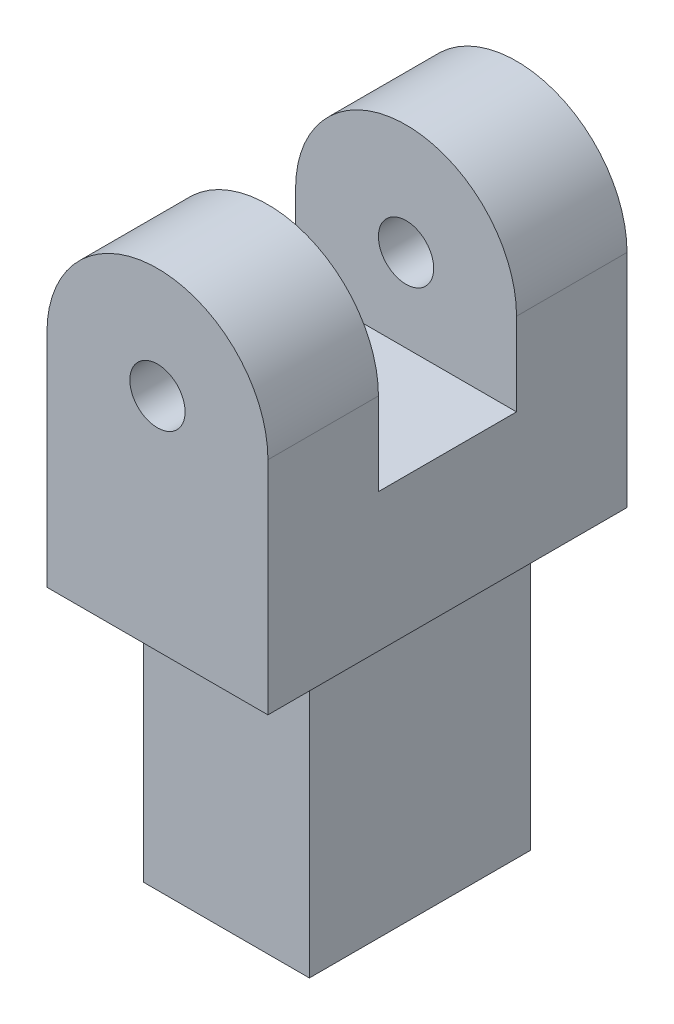
ISO-10303-21;
HEADER;
FILE_DESCRIPTION(('STEP AP214'),'2;1');
FILE_NAME('part.step','',(''),(''),'','','');
FILE_SCHEMA(('AUTOMOTIVE_DESIGN { 1 0 10303 214 1 1 1 1 }'));
ENDSEC;
DATA;
#1=APPLICATION_CONTEXT('core data for automotive mechanical design processes');
#2=APPLICATION_PROTOCOL_DEFINITION('international standard','automotive_design',2000,#1);
#3=PRODUCT_CONTEXT('',#1,'mechanical');
#4=PRODUCT('Part','Part','',(#3));
#5=PRODUCT_RELATED_PRODUCT_CATEGORY('part','',(#4));
#6=PRODUCT_DEFINITION_FORMATION('','',#4);
#7=PRODUCT_DEFINITION_CONTEXT('part definition',#1,'design');
#8=PRODUCT_DEFINITION('design','',#6,#7);
#9=PRODUCT_DEFINITION_SHAPE('','',#8);
#10=(LENGTH_UNIT() NAMED_UNIT(*) SI_UNIT(.MILLI.,.METRE.));
#11=(NAMED_UNIT(*) PLANE_ANGLE_UNIT() SI_UNIT($,.RADIAN.));
#12=(NAMED_UNIT(*) SI_UNIT($,.STERADIAN.) SOLID_ANGLE_UNIT());
#13=UNCERTAINTY_MEASURE_WITH_UNIT(LENGTH_MEASURE(1.E-05),#10,'distance_accuracy_value','');
#14=(GEOMETRIC_REPRESENTATION_CONTEXT(3) GLOBAL_UNCERTAINTY_ASSIGNED_CONTEXT((#13)) GLOBAL_UNIT_ASSIGNED_CONTEXT((#10,
#11,#12)) REPRESENTATION_CONTEXT('',''));
#15=CARTESIAN_POINT('',(0.,0.,0.));
#16=DIRECTION('',(0.,0.,1.));
#17=DIRECTION('',(1.,0.,0.));
#18=AXIS2_PLACEMENT_3D('',#15,#16,#17);
#19=CARTESIAN_POINT('',(-4.,12.,6.5));
#20=DIRECTION('',(0.,0.,-1.));
#21=DIRECTION('',(-1.,0.,0.));
#22=AXIS2_PLACEMENT_3D('',#19,#20,#21);
#23=PLANE('',#22);
#24=CARTESIAN_POINT('',(0.,8.,6.5));
#25=DIRECTION('',(0.,0.,-1.));
#26=DIRECTION('',(-1.,0.,0.));
#27=AXIS2_PLACEMENT_3D('',#24,#25,#26);
#28=CIRCLE('',#27,1.);
#29=CARTESIAN_POINT('',(-1.,8.,6.5));
#30=VERTEX_POINT('',#29);
#31=EDGE_CURVE('E164',#30,#30,#28,.T.);
#32=ORIENTED_EDGE('',*,*,#31,.T.);
#33=EDGE_LOOP('',(#32));
#34=FACE_BOUND('',#33,.T.);
#35=CARTESIAN_POINT('',(0.,8.,6.5));
#36=DIRECTION('',(0.,0.,1.));
#37=DIRECTION('',(1.,0.,0.));
#38=AXIS2_PLACEMENT_3D('',#35,#36,#37);
#39=CIRCLE('',#38,4.);
#40=CARTESIAN_POINT('',(-4.,8.,6.5));
#41=VERTEX_POINT('',#40);
#42=CARTESIAN_POINT('',(4.,8.,6.5));
#43=VERTEX_POINT('',#42);
#44=EDGE_CURVE('E152',#41,#43,#39,.F.);
#45=ORIENTED_EDGE('',*,*,#44,.F.);
#46=DIRECTION('',(0.,-1.,0.));
#47=VECTOR('',#46,1.);
#48=CARTESIAN_POINT('',(-4.,12.,6.5));
#49=LINE('',#48,#47);
#50=CARTESIAN_POINT('',(-4.,0.,6.5));
#51=VERTEX_POINT('',#50);
#52=EDGE_CURVE('E210',#41,#51,#49,.T.);
#53=ORIENTED_EDGE('',*,*,#52,.T.);
#54=DIRECTION('',(1.,0.,0.));
#55=VECTOR('',#54,1.);
#56=CARTESIAN_POINT('',(-4.,0.,6.5));
#57=LINE('',#56,#55);
#58=CARTESIAN_POINT('',(4.,0.,6.5));
#59=VERTEX_POINT('',#58);
#60=EDGE_CURVE('E195',#51,#59,#57,.T.);
#61=ORIENTED_EDGE('',*,*,#60,.T.);
#62=DIRECTION('',(0.,-1.,0.));
#63=VECTOR('',#62,1.);
#64=CARTESIAN_POINT('',(4.,12.,6.5));
#65=LINE('',#64,#63);
#66=EDGE_CURVE('E208',#43,#59,#65,.T.);
#67=ORIENTED_EDGE('',*,*,#66,.F.);
#68=EDGE_LOOP('',(#45,#53,#61,#67));
#69=FACE_BOUND('',#68,.T.);
#70=ADVANCED_FACE('F33',(#34,#69),#23,.F.);
#71=CARTESIAN_POINT('',(-4.,12.,-6.5));
#72=DIRECTION('',(0.,0.,1.));
#73=DIRECTION('',(1.,0.,0.));
#74=AXIS2_PLACEMENT_3D('',#71,#72,#73);
#75=PLANE('',#74);
#76=CARTESIAN_POINT('',(0.,8.,-6.5));
#77=DIRECTION('',(0.,0.,-1.));
#78=DIRECTION('',(-1.,0.,0.));
#79=AXIS2_PLACEMENT_3D('',#76,#77,#78);
#80=CIRCLE('',#79,1.);
#81=CARTESIAN_POINT('',(-1.,8.,-6.5));
#82=VERTEX_POINT('',#81);
#83=EDGE_CURVE('E163',#82,#82,#80,.T.);
#84=ORIENTED_EDGE('',*,*,#83,.F.);
#85=EDGE_LOOP('',(#84));
#86=FACE_BOUND('',#85,.T.);
#87=DIRECTION('',(0.,-1.,0.));
#88=VECTOR('',#87,1.);
#89=CARTESIAN_POINT('',(-4.,12.,-6.5));
#90=LINE('',#89,#88);
#91=CARTESIAN_POINT('',(-4.,8.,-6.5));
#92=VERTEX_POINT('',#91);
#93=CARTESIAN_POINT('',(-4.,0.,-6.5));
#94=VERTEX_POINT('',#93);
#95=EDGE_CURVE('E204',#92,#94,#90,.T.);
#96=ORIENTED_EDGE('',*,*,#95,.F.);
#97=CARTESIAN_POINT('',(0.,8.,-6.5));
#98=DIRECTION('',(0.,0.,1.));
#99=DIRECTION('',(1.,0.,0.));
#100=AXIS2_PLACEMENT_3D('',#97,#98,#99);
#101=CIRCLE('',#100,4.);
#102=CARTESIAN_POINT('',(4.,8.,-6.5));
#103=VERTEX_POINT('',#102);
#104=EDGE_CURVE('E151',#92,#103,#101,.F.);
#105=ORIENTED_EDGE('',*,*,#104,.T.);
#106=DIRECTION('',(0.,-1.,0.));
#107=VECTOR('',#106,1.);
#108=CARTESIAN_POINT('',(4.,12.,-6.5));
#109=LINE('',#108,#107);
#110=CARTESIAN_POINT('',(4.,0.,-6.5));
#111=VERTEX_POINT('',#110);
#112=EDGE_CURVE('E206',#103,#111,#109,.T.);
#113=ORIENTED_EDGE('',*,*,#112,.T.);
#114=DIRECTION('',(-1.,0.,0.));
#115=VECTOR('',#114,1.);
#116=CARTESIAN_POINT('',(-4.,0.,-6.5));
#117=LINE('',#116,#115);
#118=EDGE_CURVE('E201',#111,#94,#117,.T.);
#119=ORIENTED_EDGE('',*,*,#118,.T.);
#120=EDGE_LOOP('',(#96,#105,#113,#119));
#121=FACE_BOUND('',#120,.T.);
#122=ADVANCED_FACE('F237',(#86,#121),#75,.F.);
#123=CARTESIAN_POINT('',(-6.5,5.,-2.5));
#124=DIRECTION('',(0.,0.,-1.));
#125=DIRECTION('',(-1.,0.,0.));
#126=AXIS2_PLACEMENT_3D('',#123,#124,#125);
#127=PLANE('',#126);
#128=CARTESIAN_POINT('',(0.,8.,-2.5));
#129=DIRECTION('',(0.,0.,-1.));
#130=DIRECTION('',(-1.,0.,0.));
#131=AXIS2_PLACEMENT_3D('',#128,#129,#130);
#132=CIRCLE('',#131,1.);
#133=CARTESIAN_POINT('',(-1.,8.,-2.5));
#134=VERTEX_POINT('',#133);
#135=EDGE_CURVE('E170',#134,#134,#132,.T.);
#136=ORIENTED_EDGE('',*,*,#135,.T.);
#137=EDGE_LOOP('',(#136));
#138=FACE_BOUND('',#137,.T.);
#139=CARTESIAN_POINT('',(0.,8.,-2.5));
#140=DIRECTION('',(0.,0.,-1.));
#141=DIRECTION('',(-1.,0.,0.));
#142=AXIS2_PLACEMENT_3D('',#139,#140,#141);
#143=CIRCLE('',#142,4.);
#144=CARTESIAN_POINT('',(-4.,8.,-2.5));
#145=VERTEX_POINT('',#144);
#146=CARTESIAN_POINT('',(4.,8.,-2.50000000000002));
#147=VERTEX_POINT('',#146);
#148=EDGE_CURVE('E160',#145,#147,#143,.T.);
#149=ORIENTED_EDGE('',*,*,#148,.F.);
#150=DIRECTION('',(0.,1.,0.));
#151=VECTOR('',#150,1.);
#152=CARTESIAN_POINT('',(-4.,12.,-2.5));
#153=LINE('',#152,#151);
#154=CARTESIAN_POINT('',(-4.,5.,-2.5));
#155=VERTEX_POINT('',#154);
#156=EDGE_CURVE('E186',#155,#145,#153,.T.);
#157=ORIENTED_EDGE('',*,*,#156,.F.);
#158=DIRECTION('',(-1.,0.,0.));
#159=VECTOR('',#158,1.);
#160=CARTESIAN_POINT('',(-6.5,5.,-2.5));
#161=LINE('',#160,#159);
#162=CARTESIAN_POINT('',(4.,5.,-2.5));
#163=VERTEX_POINT('',#162);
#164=EDGE_CURVE('E176',#163,#155,#161,.T.);
#165=ORIENTED_EDGE('',*,*,#164,.F.);
#166=DIRECTION('',(0.,-1.,0.));
#167=VECTOR('',#166,1.);
#168=CARTESIAN_POINT('',(4.,12.,-2.5));
#169=LINE('',#168,#167);
#170=EDGE_CURVE('E184',#147,#163,#169,.T.);
#171=ORIENTED_EDGE('',*,*,#170,.F.);
#172=EDGE_LOOP('',(#149,#157,#165,#171));
#173=FACE_BOUND('',#172,.T.);
#174=ADVANCED_FACE('F242',(#138,#173),#127,.F.);
#175=CARTESIAN_POINT('',(-6.5,5.,2.5));
#176=DIRECTION('',(0.,0.,1.));
#177=DIRECTION('',(1.,0.,0.));
#178=AXIS2_PLACEMENT_3D('',#175,#176,#177);
#179=PLANE('',#178);
#180=CARTESIAN_POINT('',(0.,8.,2.5));
#181=DIRECTION('',(0.,0.,1.));
#182=DIRECTION('',(1.,0.,0.));
#183=AXIS2_PLACEMENT_3D('',#180,#181,#182);
#184=CIRCLE('',#183,1.);
#185=CARTESIAN_POINT('',(-1.,8.,2.5));
#186=VERTEX_POINT('',#185);
#187=EDGE_CURVE('E167',#186,#186,#184,.T.);
#188=ORIENTED_EDGE('',*,*,#187,.T.);
#189=EDGE_LOOP('',(#188));
#190=FACE_BOUND('',#189,.T.);
#191=DIRECTION('',(0.,-1.,0.));
#192=VECTOR('',#191,1.);
#193=CARTESIAN_POINT('',(-4.,12.,2.5));
#194=LINE('',#193,#192);
#195=CARTESIAN_POINT('',(-4.,8.,2.5));
#196=VERTEX_POINT('',#195);
#197=CARTESIAN_POINT('',(-4.,5.,2.5));
#198=VERTEX_POINT('',#197);
#199=EDGE_CURVE('E182',#196,#198,#194,.T.);
#200=ORIENTED_EDGE('',*,*,#199,.F.);
#201=CARTESIAN_POINT('',(0.,8.,2.5));
#202=DIRECTION('',(0.,0.,1.));
#203=DIRECTION('',(1.,0.,0.));
#204=AXIS2_PLACEMENT_3D('',#201,#202,#203);
#205=CIRCLE('',#204,4.);
#206=CARTESIAN_POINT('',(4.,8.,2.5));
#207=VERTEX_POINT('',#206);
#208=EDGE_CURVE('E11',#207,#196,#205,.T.);
#209=ORIENTED_EDGE('',*,*,#208,.F.);
#210=DIRECTION('',(0.,1.,0.));
#211=VECTOR('',#210,1.);
#212=CARTESIAN_POINT('',(4.,12.,2.5));
#213=LINE('',#212,#211);
#214=CARTESIAN_POINT('',(4.,5.,2.5));
#215=VERTEX_POINT('',#214);
#216=EDGE_CURVE('E179',#215,#207,#213,.T.);
#217=ORIENTED_EDGE('',*,*,#216,.F.);
#218=DIRECTION('',(1.,0.,0.));
#219=VECTOR('',#218,1.);
#220=CARTESIAN_POINT('',(-6.5,5.,2.5));
#221=LINE('',#220,#219);
#222=EDGE_CURVE('E173',#198,#215,#221,.T.);
#223=ORIENTED_EDGE('',*,*,#222,.F.);
#224=EDGE_LOOP('',(#200,#209,#217,#223));
#225=FACE_BOUND('',#224,.T.);
#226=ADVANCED_FACE('F216',(#190,#225),#179,.F.);
#227=CARTESIAN_POINT('',(-4.,12.,6.5));
#228=DIRECTION('',(1.,0.,0.));
#229=DIRECTION('',(0.,0.,-1.));
#230=AXIS2_PLACEMENT_3D('',#227,#228,#229);
#231=PLANE('',#230);
#232=ORIENTED_EDGE('',*,*,#52,.F.);
#233=DIRECTION('',(0.,0.,1.));
#234=VECTOR('',#233,1.);
#235=CARTESIAN_POINT('',(-4.,8.,-30.7706097986845));
#236=LINE('',#235,#234);
#237=EDGE_CURVE('E141',#196,#41,#236,.T.);
#238=ORIENTED_EDGE('',*,*,#237,.F.);
#239=ORIENTED_EDGE('',*,*,#199,.T.);
#240=DIRECTION('',(0.,0.,-1.));
#241=VECTOR('',#240,1.);
#242=CARTESIAN_POINT('',(-4.,5.,6.5));
#243=LINE('',#242,#241);
#244=EDGE_CURVE('E189',#198,#155,#243,.T.);
#245=ORIENTED_EDGE('',*,*,#244,.T.);
#246=ORIENTED_EDGE('',*,*,#156,.T.);
#247=EDGE_CURVE('E144',#92,#145,#236,.T.);
#248=ORIENTED_EDGE('',*,*,#247,.F.);
#249=ORIENTED_EDGE('',*,*,#95,.T.);
#250=DIRECTION('',(0.,0.,1.));
#251=VECTOR('',#250,1.);
#252=CARTESIAN_POINT('',(-4.,0.,6.5));
#253=LINE('',#252,#251);
#254=EDGE_CURVE('E192',#94,#51,#253,.T.);
#255=ORIENTED_EDGE('',*,*,#254,.T.);
#256=EDGE_LOOP('',(#232,#238,#239,#245,#246,#248,#249,#255));
#257=FACE_BOUND('',#256,.T.);
#258=ADVANCED_FACE('F35',(#257),#231,.F.);
#259=CARTESIAN_POINT('',(4.,12.,6.5));
#260=DIRECTION('',(-1.,0.,0.));
#261=DIRECTION('',(0.,0.,1.));
#262=AXIS2_PLACEMENT_3D('',#259,#260,#261);
#263=PLANE('',#262);
#264=ORIENTED_EDGE('',*,*,#112,.F.);
#265=DIRECTION('',(0.,0.,1.));
#266=VECTOR('',#265,1.);
#267=CARTESIAN_POINT('',(4.,8.,-35.7706097986845));
#268=LINE('',#267,#266);
#269=EDGE_CURVE('E157',#103,#147,#268,.T.);
#270=ORIENTED_EDGE('',*,*,#269,.T.);
#271=ORIENTED_EDGE('',*,*,#170,.T.);
#272=DIRECTION('',(0.,0.,1.));
#273=VECTOR('',#272,1.);
#274=CARTESIAN_POINT('',(4.,5.,6.5));
#275=LINE('',#274,#273);
#276=EDGE_CURVE('E41',#163,#215,#275,.T.);
#277=ORIENTED_EDGE('',*,*,#276,.T.);
#278=ORIENTED_EDGE('',*,*,#216,.T.);
#279=EDGE_CURVE('E155',#207,#43,#268,.T.);
#280=ORIENTED_EDGE('',*,*,#279,.T.);
#281=ORIENTED_EDGE('',*,*,#66,.T.);
#282=DIRECTION('',(0.,0.,-1.));
#283=VECTOR('',#282,1.);
#284=CARTESIAN_POINT('',(4.,0.,6.5));
#285=LINE('',#284,#283);
#286=EDGE_CURVE('E198',#59,#111,#285,.T.);
#287=ORIENTED_EDGE('',*,*,#286,.T.);
#288=EDGE_LOOP('',(#264,#270,#271,#277,#278,#280,#281,#287));
#289=FACE_BOUND('',#288,.T.);
#290=ADVANCED_FACE('F247',(#289),#263,.F.);
#291=CARTESIAN_POINT('',(0.,0.,0.));
#292=DIRECTION('',(0.,-1.,0.));
#293=DIRECTION('',(0.,0.,-1.));
#294=AXIS2_PLACEMENT_3D('',#291,#292,#293);
#295=PLANE('',#294);
#296=DIRECTION('',(0.,0.,-1.));
#297=VECTOR('',#296,1.);
#298=CARTESIAN_POINT('',(-3.,0.,-4.));
#299=LINE('',#298,#297);
#300=CARTESIAN_POINT('',(-3.,0.,4.));
#301=VERTEX_POINT('',#300);
#302=CARTESIAN_POINT('',(-3.,0.,-4.));
#303=VERTEX_POINT('',#302);
#304=EDGE_CURVE('E48',#301,#303,#299,.T.);
#305=ORIENTED_EDGE('',*,*,#304,.F.);
#306=DIRECTION('',(-1.,0.,0.));
#307=VECTOR('',#306,1.);
#308=CARTESIAN_POINT('',(-3.,0.,4.));
#309=LINE('',#308,#307);
#310=CARTESIAN_POINT('',(3.,0.,4.));
#311=VERTEX_POINT('',#310);
#312=EDGE_CURVE('E52',#311,#301,#309,.T.);
#313=ORIENTED_EDGE('',*,*,#312,.F.);
#314=DIRECTION('',(0.,0.,1.));
#315=VECTOR('',#314,1.);
#316=CARTESIAN_POINT('',(3.,0.,-4.));
#317=LINE('',#316,#315);
#318=CARTESIAN_POINT('',(3.,0.,-4.));
#319=VERTEX_POINT('',#318);
#320=EDGE_CURVE('E406',#319,#311,#317,.T.);
#321=ORIENTED_EDGE('',*,*,#320,.F.);
#322=DIRECTION('',(1.,0.,0.));
#323=VECTOR('',#322,1.);
#324=CARTESIAN_POINT('',(-3.,0.,-4.));
#325=LINE('',#324,#323);
#326=EDGE_CURVE('E412',#303,#319,#325,.T.);
#327=ORIENTED_EDGE('',*,*,#326,.F.);
#328=EDGE_LOOP('',(#305,#313,#321,#327));
#329=FACE_BOUND('',#328,.T.);
#330=ORIENTED_EDGE('',*,*,#254,.F.);
#331=ORIENTED_EDGE('',*,*,#118,.F.);
#332=ORIENTED_EDGE('',*,*,#286,.F.);
#333=ORIENTED_EDGE('',*,*,#60,.F.);
#334=EDGE_LOOP('',(#330,#331,#332,#333));
#335=FACE_BOUND('',#334,.T.);
#336=ADVANCED_FACE('F231',(#329,#335),#295,.T.);
#337=CARTESIAN_POINT('',(0.,5.,0.));
#338=DIRECTION('',(0.,-1.,0.));
#339=DIRECTION('',(0.,0.,-1.));
#340=AXIS2_PLACEMENT_3D('',#337,#338,#339);
#341=PLANE('',#340);
#342=ORIENTED_EDGE('',*,*,#222,.T.);
#343=ORIENTED_EDGE('',*,*,#276,.F.);
#344=ORIENTED_EDGE('',*,*,#164,.T.);
#345=ORIENTED_EDGE('',*,*,#244,.F.);
#346=EDGE_LOOP('',(#342,#343,#344,#345));
#347=FACE_BOUND('',#346,.T.);
#348=ADVANCED_FACE('F222',(#347),#341,.F.);
#349=CARTESIAN_POINT('',(0.,8.,6.5));
#350=DIRECTION('',(0.,0.,-1.));
#351=DIRECTION('',(-1.,0.,0.));
#352=AXIS2_PLACEMENT_3D('',#349,#350,#351);
#353=CYLINDRICAL_SURFACE('',#352,1.);
#354=CARTESIAN_POINT('',(-1.,8.,6.5));
#355=CARTESIAN_POINT('',(-1.,8.,6.45833333333333));
#356=CARTESIAN_POINT('',(-1.,8.,6.41666666666667));
#357=CARTESIAN_POINT('',(-1.,8.,6.33333333333333));
#358=CARTESIAN_POINT('',(-1.,8.,6.29166666666667));
#359=CARTESIAN_POINT('',(-1.,8.,6.20833333333333));
#360=CARTESIAN_POINT('',(-1.,8.,6.16666666666667));
#361=CARTESIAN_POINT('',(-1.,8.,6.08333333333333));
#362=CARTESIAN_POINT('',(-1.,8.,6.04166666666667));
#363=CARTESIAN_POINT('',(-1.,8.,5.95833333333333));
#364=CARTESIAN_POINT('',(-1.,8.,5.91666666666667));
#365=CARTESIAN_POINT('',(-1.,8.,5.83333333333333));
#366=CARTESIAN_POINT('',(-1.,8.,5.79166666666667));
#367=CARTESIAN_POINT('',(-1.,8.,5.70833333333333));
#368=CARTESIAN_POINT('',(-1.,8.,5.66666666666667));
#369=CARTESIAN_POINT('',(-1.,8.,5.58333333333333));
#370=CARTESIAN_POINT('',(-1.,8.,5.54166666666667));
#371=CARTESIAN_POINT('',(-1.,8.,5.45833333333333));
#372=CARTESIAN_POINT('',(-1.,8.,5.41666666666667));
#373=CARTESIAN_POINT('',(-1.,8.,5.33333333333333));
#374=CARTESIAN_POINT('',(-1.,8.,5.29166666666667));
#375=CARTESIAN_POINT('',(-1.,8.,5.20833333333333));
#376=CARTESIAN_POINT('',(-1.,8.,5.16666666666667));
#377=CARTESIAN_POINT('',(-1.,8.,5.08333333333333));
#378=CARTESIAN_POINT('',(-1.,8.,5.04166666666667));
#379=CARTESIAN_POINT('',(-1.,8.,4.95833333333333));
#380=CARTESIAN_POINT('',(-1.,8.,4.91666666666667));
#381=CARTESIAN_POINT('',(-1.,8.,4.83333333333333));
#382=CARTESIAN_POINT('',(-1.,8.,4.79166666666667));
#383=CARTESIAN_POINT('',(-1.,8.,4.70833333333333));
#384=CARTESIAN_POINT('',(-1.,8.,4.66666666666667));
#385=CARTESIAN_POINT('',(-1.,8.,4.58333333333333));
#386=CARTESIAN_POINT('',(-1.,8.,4.54166666666667));
#387=CARTESIAN_POINT('',(-1.,8.,4.45833333333333));
#388=CARTESIAN_POINT('',(-1.,8.,4.41666666666667));
#389=CARTESIAN_POINT('',(-1.,8.,4.33333333333333));
#390=CARTESIAN_POINT('',(-1.,8.,4.29166666666667));
#391=CARTESIAN_POINT('',(-1.,8.,4.20833333333333));
#392=CARTESIAN_POINT('',(-1.,8.,4.16666666666667));
#393=CARTESIAN_POINT('',(-1.,8.,4.08333333333333));
#394=CARTESIAN_POINT('',(-1.,8.,4.04166666666667));
#395=CARTESIAN_POINT('',(-1.,8.,3.95833333333333));
#396=CARTESIAN_POINT('',(-1.,8.,3.91666666666667));
#397=CARTESIAN_POINT('',(-1.,8.,3.83333333333333));
#398=CARTESIAN_POINT('',(-1.,8.,3.79166666666667));
#399=CARTESIAN_POINT('',(-1.,8.,3.70833333333333));
#400=CARTESIAN_POINT('',(-1.,8.,3.66666666666667));
#401=CARTESIAN_POINT('',(-1.,8.,3.58333333333333));
#402=CARTESIAN_POINT('',(-1.,8.,3.54166666666667));
#403=CARTESIAN_POINT('',(-1.,8.,3.45833333333333));
#404=CARTESIAN_POINT('',(-1.,8.,3.41666666666667));
#405=CARTESIAN_POINT('',(-1.,8.,3.33333333333333));
#406=CARTESIAN_POINT('',(-1.,8.,3.29166666666667));
#407=CARTESIAN_POINT('',(-1.,8.,3.20833333333333));
#408=CARTESIAN_POINT('',(-1.,8.,3.16666666666667));
#409=CARTESIAN_POINT('',(-1.,8.,3.08333333333333));
#410=CARTESIAN_POINT('',(-1.,8.,3.04166666666667));
#411=CARTESIAN_POINT('',(-1.,8.,2.95833333333333));
#412=CARTESIAN_POINT('',(-1.,8.,2.91666666666667));
#413=CARTESIAN_POINT('',(-1.,8.,2.83333333333333));
#414=CARTESIAN_POINT('',(-1.,8.,2.79166666666667));
#415=CARTESIAN_POINT('',(-1.,8.,2.70833333333333));
#416=CARTESIAN_POINT('',(-1.,8.,2.66666666666667));
#417=CARTESIAN_POINT('',(-1.,8.,2.58333333333333));
#418=CARTESIAN_POINT('',(-1.,8.,2.54166666666667));
#419=CARTESIAN_POINT('',(-1.,8.,2.5));
#420=B_SPLINE_CURVE_WITH_KNOTS('',3,(#354,#355,#356,#357,#358,#359,#360,#361,#362,#363,#364,
#365,#366,#367,#368,#369,#370,#371,#372,#373,#374,#375,#376,#377,#378,#379,#380,#381,#382,#383,
#384,#385,#386,#387,#388,#389,#390,#391,#392,#393,#394,#395,#396,#397,#398,#399,#400,#401,#402,
#403,#404,#405,#406,#407,#408,#409,#410,#411,#412,#413,#414,#415,#416,#417,#418,#419),
.UNSPECIFIED.,.F.,.F.,(4,2,2,2,2,2,2,2,2,2,2,2,2,2,2,2,2,2,2,2,2,2,2,2,2,2,2,2,2,2,2,2,4),(0.,
0.125,0.25,0.375,0.5,0.625000000000001,0.75,0.875,1.,1.125,1.25,1.375,1.5,1.625,1.75,1.875,2.,
2.125,2.25,2.375,2.5,2.625,2.75,2.875,3.,3.125,3.25,3.375,3.5,3.625,3.75,3.875,4.),.UNSPECIFIED.);
#421=EDGE_CURVE('BSEAM219',#30,#186,#420,.T.);
#422=ORIENTED_EDGE('',*,*,#31,.F.);
#423=ORIENTED_EDGE('',*,*,#187,.F.);
#424=ORIENTED_EDGE('',*,*,#421,.T.);
#425=ORIENTED_EDGE('',*,*,#421,.F.);
#426=EDGE_LOOP('',(#422,#424,#423,#425));
#427=FACE_BOUND('',#426,.T.);
#428=ADVANCED_FACE('F219',(#427),#353,.F.);
#429=CARTESIAN_POINT('',(-1.,8.,-6.5));
#430=CARTESIAN_POINT('',(-1.,8.,-6.45833333333333));
#431=CARTESIAN_POINT('',(-1.,8.,-6.41666666666667));
#432=CARTESIAN_POINT('',(-1.,8.,-6.33333333333333));
#433=CARTESIAN_POINT('',(-1.,8.,-6.29166666666667));
#434=CARTESIAN_POINT('',(-1.,8.,-6.20833333333333));
#435=CARTESIAN_POINT('',(-1.,8.,-6.16666666666667));
#436=CARTESIAN_POINT('',(-1.,8.,-6.08333333333333));
#437=CARTESIAN_POINT('',(-1.,8.,-6.04166666666667));
#438=CARTESIAN_POINT('',(-1.,8.,-5.95833333333333));
#439=CARTESIAN_POINT('',(-1.,8.,-5.91666666666667));
#440=CARTESIAN_POINT('',(-1.,8.,-5.83333333333333));
#441=CARTESIAN_POINT('',(-1.,8.,-5.79166666666667));
#442=CARTESIAN_POINT('',(-1.,8.,-5.70833333333333));
#443=CARTESIAN_POINT('',(-1.,8.,-5.66666666666667));
#444=CARTESIAN_POINT('',(-1.,8.,-5.58333333333333));
#445=CARTESIAN_POINT('',(-1.,8.,-5.54166666666667));
#446=CARTESIAN_POINT('',(-1.,8.,-5.45833333333333));
#447=CARTESIAN_POINT('',(-1.,8.,-5.41666666666667));
#448=CARTESIAN_POINT('',(-1.,8.,-5.33333333333333));
#449=CARTESIAN_POINT('',(-1.,8.,-5.29166666666667));
#450=CARTESIAN_POINT('',(-1.,8.,-5.20833333333333));
#451=CARTESIAN_POINT('',(-1.,8.,-5.16666666666667));
#452=CARTESIAN_POINT('',(-1.,8.,-5.08333333333333));
#453=CARTESIAN_POINT('',(-1.,8.,-5.04166666666667));
#454=CARTESIAN_POINT('',(-1.,8.,-4.95833333333333));
#455=CARTESIAN_POINT('',(-1.,8.,-4.91666666666667));
#456=CARTESIAN_POINT('',(-1.,8.,-4.83333333333333));
#457=CARTESIAN_POINT('',(-1.,8.,-4.79166666666667));
#458=CARTESIAN_POINT('',(-1.,8.,-4.70833333333333));
#459=CARTESIAN_POINT('',(-1.,8.,-4.66666666666667));
#460=CARTESIAN_POINT('',(-1.,8.,-4.58333333333333));
#461=CARTESIAN_POINT('',(-1.,8.,-4.54166666666667));
#462=CARTESIAN_POINT('',(-1.,8.,-4.45833333333333));
#463=CARTESIAN_POINT('',(-1.,8.,-4.41666666666667));
#464=CARTESIAN_POINT('',(-1.,8.,-4.33333333333333));
#465=CARTESIAN_POINT('',(-1.,8.,-4.29166666666667));
#466=CARTESIAN_POINT('',(-1.,8.,-4.20833333333333));
#467=CARTESIAN_POINT('',(-1.,8.,-4.16666666666667));
#468=CARTESIAN_POINT('',(-1.,8.,-4.08333333333333));
#469=CARTESIAN_POINT('',(-1.,8.,-4.04166666666667));
#470=CARTESIAN_POINT('',(-1.,8.,-3.95833333333333));
#471=CARTESIAN_POINT('',(-1.,8.,-3.91666666666667));
#472=CARTESIAN_POINT('',(-1.,8.,-3.83333333333333));
#473=CARTESIAN_POINT('',(-1.,8.,-3.79166666666667));
#474=CARTESIAN_POINT('',(-1.,8.,-3.70833333333333));
#475=CARTESIAN_POINT('',(-1.,8.,-3.66666666666667));
#476=CARTESIAN_POINT('',(-1.,8.,-3.58333333333333));
#477=CARTESIAN_POINT('',(-1.,8.,-3.54166666666667));
#478=CARTESIAN_POINT('',(-1.,8.,-3.45833333333333));
#479=CARTESIAN_POINT('',(-1.,8.,-3.41666666666667));
#480=CARTESIAN_POINT('',(-1.,8.,-3.33333333333333));
#481=CARTESIAN_POINT('',(-1.,8.,-3.29166666666667));
#482=CARTESIAN_POINT('',(-1.,8.,-3.20833333333333));
#483=CARTESIAN_POINT('',(-1.,8.,-3.16666666666667));
#484=CARTESIAN_POINT('',(-1.,8.,-3.08333333333333));
#485=CARTESIAN_POINT('',(-1.,8.,-3.04166666666667));
#486=CARTESIAN_POINT('',(-1.,8.,-2.95833333333333));
#487=CARTESIAN_POINT('',(-1.,8.,-2.91666666666667));
#488=CARTESIAN_POINT('',(-1.,8.,-2.83333333333333));
#489=CARTESIAN_POINT('',(-1.,8.,-2.79166666666667));
#490=CARTESIAN_POINT('',(-1.,8.,-2.70833333333333));
#491=CARTESIAN_POINT('',(-1.,8.,-2.66666666666667));
#492=CARTESIAN_POINT('',(-1.,8.,-2.58333333333333));
#493=CARTESIAN_POINT('',(-1.,8.,-2.54166666666667));
#494=CARTESIAN_POINT('',(-1.,8.,-2.5));
#495=B_SPLINE_CURVE_WITH_KNOTS('',3,(#429,#430,#431,#432,#433,#434,#435,#436,#437,#438,#439,
#440,#441,#442,#443,#444,#445,#446,#447,#448,#449,#450,#451,#452,#453,#454,#455,#456,#457,#458,
#459,#460,#461,#462,#463,#464,#465,#466,#467,#468,#469,#470,#471,#472,#473,#474,#475,#476,#477,
#478,#479,#480,#481,#482,#483,#484,#485,#486,#487,#488,#489,#490,#491,#492,#493,#494),
.UNSPECIFIED.,.F.,.F.,(4,2,2,2,2,2,2,2,2,2,2,2,2,2,2,2,2,2,2,2,2,2,2,2,2,2,2,2,2,2,2,2,4),(0.,
0.125,0.25,0.375,0.5,0.625000000000001,0.750000000000001,0.875000000000001,1.,1.125,1.25,1.375,
1.5,1.625,1.75,1.875,2.,2.125,2.25,2.375,2.5,2.625,2.75,2.875,3.,3.125,3.25,3.375,3.5,3.625,
3.75,3.875,4.),.UNSPECIFIED.);
#496=EDGE_CURVE('BSEAM221',#82,#134,#495,.T.);
#497=ORIENTED_EDGE('',*,*,#83,.T.);
#498=ORIENTED_EDGE('',*,*,#135,.F.);
#499=ORIENTED_EDGE('',*,*,#496,.T.);
#500=ORIENTED_EDGE('',*,*,#496,.F.);
#501=EDGE_LOOP('',(#497,#499,#498,#500));
#502=FACE_BOUND('',#501,.T.);
#503=ADVANCED_FACE('F221',(#502),#353,.F.);
#504=CARTESIAN_POINT('',(0.,8.,-35.7706097986845));
#505=DIRECTION('',(0.,0.,1.));
#506=DIRECTION('',(1.,0.,0.));
#507=AXIS2_PLACEMENT_3D('',#504,#505,#506);
#508=CYLINDRICAL_SURFACE('',#507,4.);
#509=ORIENTED_EDGE('',*,*,#279,.F.);
#510=ORIENTED_EDGE('',*,*,#208,.T.);
#511=ORIENTED_EDGE('',*,*,#237,.T.);
#512=ORIENTED_EDGE('',*,*,#44,.T.);
#513=EDGE_LOOP('',(#509,#510,#511,#512));
#514=FACE_BOUND('',#513,.T.);
#515=ADVANCED_FACE('F229',(#514),#508,.T.);
#516=ORIENTED_EDGE('',*,*,#104,.F.);
#517=ORIENTED_EDGE('',*,*,#247,.T.);
#518=ORIENTED_EDGE('',*,*,#148,.T.);
#519=ORIENTED_EDGE('',*,*,#269,.F.);
#520=EDGE_LOOP('',(#516,#517,#518,#519));
#521=FACE_BOUND('',#520,.T.);
#522=ADVANCED_FACE('F265',(#521),#508,.T.);
#523=CARTESIAN_POINT('',(-3.,-10.,-4.));
#524=DIRECTION('',(1.,0.,0.));
#525=DIRECTION('',(0.,0.,-1.));
#526=AXIS2_PLACEMENT_3D('',#523,#524,#525);
#527=PLANE('',#526);
#528=ORIENTED_EDGE('',*,*,#304,.T.);
#529=DIRECTION('',(0.,1.,0.));
#530=VECTOR('',#529,1.);
#531=CARTESIAN_POINT('',(-3.,-10.,-4.));
#532=LINE('',#531,#530);
#533=CARTESIAN_POINT('',(-3.,-10.,-4.));
#534=VERTEX_POINT('',#533);
#535=EDGE_CURVE('E124',#534,#303,#532,.T.);
#536=ORIENTED_EDGE('',*,*,#535,.F.);
#537=DIRECTION('',(0.,0.,-1.));
#538=VECTOR('',#537,1.);
#539=CARTESIAN_POINT('',(-3.,-10.,-4.));
#540=LINE('',#539,#538);
#541=CARTESIAN_POINT('',(-3.,-10.,4.));
#542=VERTEX_POINT('',#541);
#543=EDGE_CURVE('E130',#542,#534,#540,.T.);
#544=ORIENTED_EDGE('',*,*,#543,.F.);
#545=DIRECTION('',(0.,1.,0.));
#546=VECTOR('',#545,1.);
#547=CARTESIAN_POINT('',(-3.,-10.,4.));
#548=LINE('',#547,#546);
#549=EDGE_CURVE('E404',#542,#301,#548,.T.);
#550=ORIENTED_EDGE('',*,*,#549,.T.);
#551=EDGE_LOOP('',(#528,#536,#544,#550));
#552=FACE_BOUND('',#551,.T.);
#553=ADVANCED_FACE('F140',(#552),#527,.F.);
#554=CARTESIAN_POINT('',(-3.,-10.,-4.));
#555=DIRECTION('',(0.,0.,1.));
#556=DIRECTION('',(1.,0.,0.));
#557=AXIS2_PLACEMENT_3D('',#554,#555,#556);
#558=PLANE('',#557);
#559=ORIENTED_EDGE('',*,*,#326,.T.);
#560=DIRECTION('',(0.,1.,0.));
#561=VECTOR('',#560,1.);
#562=CARTESIAN_POINT('',(3.,-10.,-4.));
#563=LINE('',#562,#561);
#564=CARTESIAN_POINT('',(3.,-10.,-4.));
#565=VERTEX_POINT('',#564);
#566=EDGE_CURVE('E126',#565,#319,#563,.T.);
#567=ORIENTED_EDGE('',*,*,#566,.F.);
#568=DIRECTION('',(1.,0.,0.));
#569=VECTOR('',#568,1.);
#570=CARTESIAN_POINT('',(-3.,-10.,-4.));
#571=LINE('',#570,#569);
#572=EDGE_CURVE('E119',#534,#565,#571,.T.);
#573=ORIENTED_EDGE('',*,*,#572,.F.);
#574=ORIENTED_EDGE('',*,*,#535,.T.);
#575=EDGE_LOOP('',(#559,#567,#573,#574));
#576=FACE_BOUND('',#575,.T.);
#577=ADVANCED_FACE('F122',(#576),#558,.F.);
#578=CARTESIAN_POINT('',(3.,-10.,-4.));
#579=DIRECTION('',(-1.,0.,0.));
#580=DIRECTION('',(0.,0.,1.));
#581=AXIS2_PLACEMENT_3D('',#578,#579,#580);
#582=PLANE('',#581);
#583=ORIENTED_EDGE('',*,*,#320,.T.);
#584=DIRECTION('',(0.,1.,0.));
#585=VECTOR('',#584,1.);
#586=CARTESIAN_POINT('',(3.,-10.,4.));
#587=LINE('',#586,#585);
#588=CARTESIAN_POINT('',(3.,-10.,4.));
#589=VERTEX_POINT('',#588);
#590=EDGE_CURVE('E146',#589,#311,#587,.T.);
#591=ORIENTED_EDGE('',*,*,#590,.F.);
#592=DIRECTION('',(0.,0.,1.));
#593=VECTOR('',#592,1.);
#594=CARTESIAN_POINT('',(3.,-10.,-4.));
#595=LINE('',#594,#593);
#596=EDGE_CURVE('E129',#565,#589,#595,.T.);
#597=ORIENTED_EDGE('',*,*,#596,.F.);
#598=ORIENTED_EDGE('',*,*,#566,.T.);
#599=EDGE_LOOP('',(#583,#591,#597,#598));
#600=FACE_BOUND('',#599,.T.);
#601=ADVANCED_FACE('F293',(#600),#582,.F.);
#602=CARTESIAN_POINT('',(-3.,-10.,4.));
#603=DIRECTION('',(0.,0.,-1.));
#604=DIRECTION('',(-1.,0.,0.));
#605=AXIS2_PLACEMENT_3D('',#602,#603,#604);
#606=PLANE('',#605);
#607=ORIENTED_EDGE('',*,*,#312,.T.);
#608=ORIENTED_EDGE('',*,*,#549,.F.);
#609=DIRECTION('',(-1.,0.,0.));
#610=VECTOR('',#609,1.);
#611=CARTESIAN_POINT('',(-3.,-10.,4.));
#612=LINE('',#611,#610);
#613=EDGE_CURVE('E135',#589,#542,#612,.T.);
#614=ORIENTED_EDGE('',*,*,#613,.F.);
#615=ORIENTED_EDGE('',*,*,#590,.T.);
#616=EDGE_LOOP('',(#607,#608,#614,#615));
#617=FACE_BOUND('',#616,.T.);
#618=ADVANCED_FACE('F296',(#617),#606,.F.);
#619=CARTESIAN_POINT('',(0.,-10.,0.));
#620=DIRECTION('',(0.,1.,0.));
#621=DIRECTION('',(0.,0.,1.));
#622=AXIS2_PLACEMENT_3D('',#619,#620,#621);
#623=PLANE('',#622);
#624=ORIENTED_EDGE('',*,*,#543,.T.);
#625=ORIENTED_EDGE('',*,*,#572,.T.);
#626=ORIENTED_EDGE('',*,*,#596,.T.);
#627=ORIENTED_EDGE('',*,*,#613,.T.);
#628=EDGE_LOOP('',(#624,#625,#626,#627));
#629=FACE_BOUND('',#628,.T.);
#630=ADVANCED_FACE('F133',(#629),#623,.F.);
#631=CLOSED_SHELL('',(#70,#122,#174,#226,#258,#290,#336,#348,#428,#503,#515,#522,#553,#577,#601,
#618,#630));
#632=MANIFOLD_SOLID_BREP('B2',#631);
#633=ADVANCED_BREP_SHAPE_REPRESENTATION('',(#18,#632),#14);
#634=SHAPE_DEFINITION_REPRESENTATION(#9,#633);
ENDSEC;
END-ISO-10303-21;
